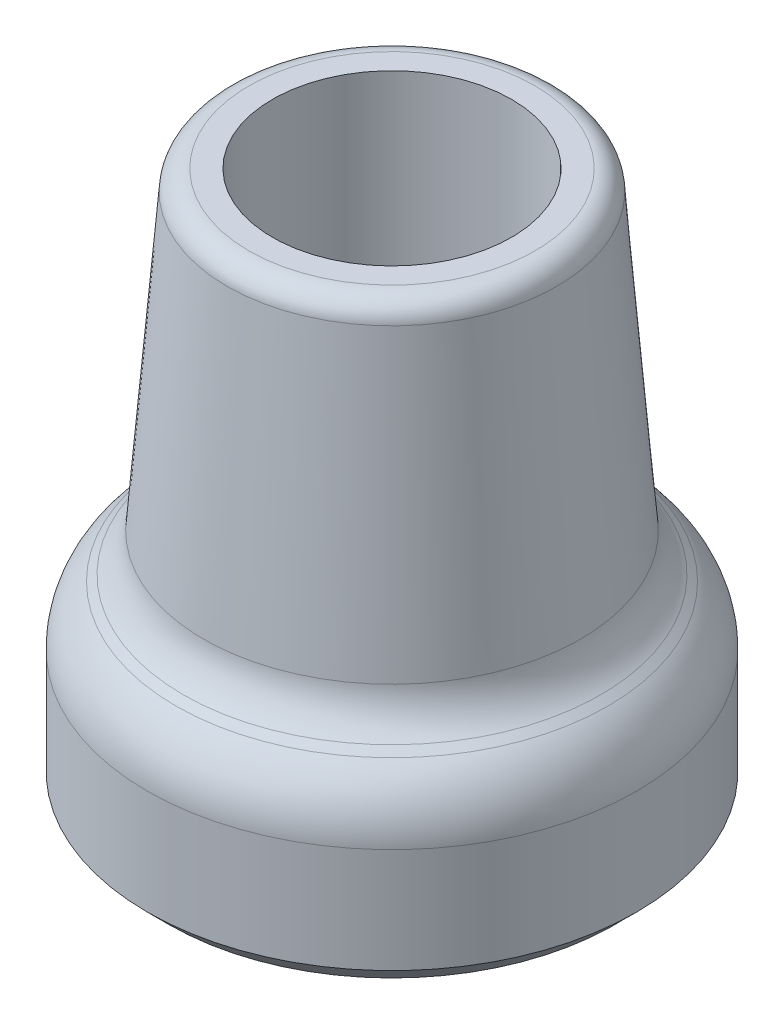
ISO-10303-21;
HEADER;
FILE_DESCRIPTION(('STEP AP214'),'2;1');
FILE_NAME('part.step','',(''),(''),'','','');
FILE_SCHEMA(('AUTOMOTIVE_DESIGN { 1 0 10303 214 1 1 1 1 }'));
ENDSEC;
DATA;
#1=APPLICATION_CONTEXT('core data for automotive mechanical design processes');
#2=APPLICATION_PROTOCOL_DEFINITION('international standard','automotive_design',2000,#1);
#3=PRODUCT_CONTEXT('',#1,'mechanical');
#4=PRODUCT('Part','Part','',(#3));
#5=PRODUCT_RELATED_PRODUCT_CATEGORY('part','',(#4));
#6=PRODUCT_DEFINITION_FORMATION('','',#4);
#7=PRODUCT_DEFINITION_CONTEXT('part definition',#1,'design');
#8=PRODUCT_DEFINITION('design','',#6,#7);
#9=PRODUCT_DEFINITION_SHAPE('','',#8);
#10=(LENGTH_UNIT() NAMED_UNIT(*) SI_UNIT(.MILLI.,.METRE.));
#11=(NAMED_UNIT(*) PLANE_ANGLE_UNIT() SI_UNIT($,.RADIAN.));
#12=(NAMED_UNIT(*) SI_UNIT($,.STERADIAN.) SOLID_ANGLE_UNIT());
#13=UNCERTAINTY_MEASURE_WITH_UNIT(LENGTH_MEASURE(1.E-05),#10,'distance_accuracy_value','');
#14=(GEOMETRIC_REPRESENTATION_CONTEXT(3) GLOBAL_UNCERTAINTY_ASSIGNED_CONTEXT((#13)) GLOBAL_UNIT_ASSIGNED_CONTEXT((#10,
#11,#12)) REPRESENTATION_CONTEXT('',''));
#15=CARTESIAN_POINT('',(0.,0.,0.));
#16=DIRECTION('',(0.,0.,1.));
#17=DIRECTION('',(1.,0.,0.));
#18=AXIS2_PLACEMENT_3D('',#15,#16,#17);
#19=CARTESIAN_POINT('',(0.,20.,0.));
#20=DIRECTION('',(0.,-1.,0.));
#21=DIRECTION('',(0.,0.,-1.));
#22=AXIS2_PLACEMENT_3D('',#19,#20,#21);
#23=PLANE('',#22);
#24=CARTESIAN_POINT('',(0.,20.,0.));
#25=DIRECTION('',(0.,-1.,0.));
#26=DIRECTION('',(0.,0.,-1.));
#27=AXIS2_PLACEMENT_3D('',#24,#25,#26);
#28=CIRCLE('',#27,10.);
#29=CARTESIAN_POINT('',(0.,20.,-10.));
#30=VERTEX_POINT('',#29);
#31=EDGE_CURVE('E10',#30,#30,#28,.F.);
#32=ORIENTED_EDGE('',*,*,#31,.T.);
#33=EDGE_LOOP('',(#32));
#34=FACE_BOUND('',#33,.T.);
#35=ADVANCED_FACE('F32',(#34),#23,.F.);
#36=CARTESIAN_POINT('',(0.,0.,0.));
#37=DIRECTION('',(0.,-1.,0.));
#38=DIRECTION('',(0.,0.,-1.));
#39=AXIS2_PLACEMENT_3D('',#36,#37,#38);
#40=CYLINDRICAL_SURFACE('',#39,11.);
#41=CARTESIAN_POINT('',(0.,21.,0.));
#42=DIRECTION('',(0.,-1.,0.));
#43=DIRECTION('',(0.,0.,-1.));
#44=AXIS2_PLACEMENT_3D('',#41,#42,#43);
#45=CIRCLE('',#44,11.);
#46=CARTESIAN_POINT('',(0.,21.,-11.));
#47=VERTEX_POINT('',#46);
#48=EDGE_CURVE('E39',#47,#47,#45,.T.);
#49=ORIENTED_EDGE('',*,*,#48,.T.);
#50=EDGE_LOOP('',(#49));
#51=FACE_BOUND('',#50,.T.);
#52=CARTESIAN_POINT('',(0.,50.,0.));
#53=DIRECTION('',(0.,-1.,0.));
#54=DIRECTION('',(0.,0.,-1.));
#55=AXIS2_PLACEMENT_3D('',#52,#53,#54);
#56=CIRCLE('',#55,11.);
#57=CARTESIAN_POINT('',(0.,50.,-11.));
#58=VERTEX_POINT('',#57);
#59=EDGE_CURVE('E70',#58,#58,#56,.T.);
#60=ORIENTED_EDGE('',*,*,#59,.F.);
#61=EDGE_LOOP('',(#60));
#62=FACE_BOUND('',#61,.T.);
#63=ADVANCED_FACE('F76',(#51,#62),#40,.F.);
#64=CARTESIAN_POINT('',(-11.,50.,0.));
#65=DIRECTION('',(0.,-1.,0.));
#66=DIRECTION('',(0.,0.,-1.));
#67=AXIS2_PLACEMENT_3D('',#64,#65,#66);
#68=PLANE('',#67);
#69=CARTESIAN_POINT('',(0.,50.,0.));
#70=DIRECTION('',(0.,-1.,0.));
#71=DIRECTION('',(0.,0.,-1.));
#72=AXIS2_PLACEMENT_3D('',#69,#70,#71);
#73=CIRCLE('',#72,13.1547972206343);
#74=CARTESIAN_POINT('',(0.,50.,-13.1547972206343));
#75=VERTEX_POINT('',#74);
#76=EDGE_CURVE('E64',#75,#75,#73,.F.);
#77=ORIENTED_EDGE('',*,*,#76,.T.);
#78=EDGE_LOOP('',(#77));
#79=FACE_BOUND('',#78,.T.);
#80=ORIENTED_EDGE('',*,*,#59,.T.);
#81=EDGE_LOOP('',(#80));
#82=FACE_BOUND('',#81,.T.);
#83=ADVANCED_FACE('F74',(#79,#82),#68,.F.);
#84=CARTESIAN_POINT('',(0.,50.,0.));
#85=DIRECTION('',(0.,-1.,0.));
#86=DIRECTION('',(0.,0.,-1.));
#87=AXIS2_PLACEMENT_3D('',#84,#85,#86);
#88=CONICAL_SURFACE('',#87,15.,0.0804710112654609);
#89=CARTESIAN_POINT('',(0.,21.1530541897,0.));
#90=DIRECTION('',(0.,-1.,0.));
#91=DIRECTION('',(0.,0.,-1.));
#92=AXIS2_PLACEMENT_3D('',#89,#90,#91);
#93=CIRCLE('',#92,17.3263665976048);
#94=CARTESIAN_POINT('',(0.,21.1530541897,-17.3263665976048));
#95=VERTEX_POINT('',#94);
#96=EDGE_CURVE('E58',#95,#95,#93,.F.);
#97=ORIENTED_EDGE('',*,*,#96,.T.);
#98=EDGE_LOOP('',(#97));
#99=FACE_BOUND('',#98,.T.);
#100=CARTESIAN_POINT('',(0.,48.1607683798407,0.));
#101=DIRECTION('',(0.,1.,0.));
#102=DIRECTION('',(0.,0.,1.));
#103=AXIS2_PLACEMENT_3D('',#100,#101,#102);
#104=CIRCLE('',#103,15.148325130658);
#105=CARTESIAN_POINT('',(0.,48.1607683798407,15.148325130658));
#106=VERTEX_POINT('',#105);
#107=EDGE_CURVE('E67',#106,#106,#104,.F.);
#108=ORIENTED_EDGE('',*,*,#107,.T.);
#109=EDGE_LOOP('',(#108));
#110=FACE_BOUND('',#109,.T.);
#111=ADVANCED_FACE('F83',(#99,#110),#88,.T.);
#112=CARTESIAN_POINT('',(0.,19.,0.));
#113=DIRECTION('',(0.,-1.,0.));
#114=DIRECTION('',(0.,0.,-1.));
#115=AXIS2_PLACEMENT_3D('',#112,#113,#114);
#116=CONICAL_SURFACE('',#115,17.5,0.896055384571344);
#117=CARTESIAN_POINT('',(0.,17.1017077336952,0.));
#118=DIRECTION('',(0.,1.,0.));
#119=DIRECTION('',(0.,0.,1.));
#120=AXIS2_PLACEMENT_3D('',#117,#118,#119);
#121=CIRCLE('',#120,19.872865332881);
#122=CARTESIAN_POINT('',(0.,17.1017077336952,19.872865332881));
#123=VERTEX_POINT('',#122);
#124=EDGE_CURVE('E52',#123,#123,#121,.T.);
#125=ORIENTED_EDGE('',*,*,#124,.T.);
#126=EDGE_LOOP('',(#125));
#127=FACE_BOUND('',#126,.T.);
#128=CARTESIAN_POINT('',(0.,17.6506310920864,0.));
#129=DIRECTION('',(0.,-1.,0.));
#130=DIRECTION('',(0.,0.,-1.));
#131=AXIS2_PLACEMENT_3D('',#128,#129,#130);
#132=CIRCLE('',#131,19.1867111348919);
#133=CARTESIAN_POINT('',(0.,17.6506310920864,-19.1867111348919));
#134=VERTEX_POINT('',#133);
#135=EDGE_CURVE('E61',#134,#134,#132,.T.);
#136=ORIENTED_EDGE('',*,*,#135,.T.);
#137=EDGE_LOOP('',(#136));
#138=FACE_BOUND('',#137,.T.);
#139=ADVANCED_FACE('F118',(#127,#138),#116,.T.);
#140=CARTESIAN_POINT('',(0.,0.,0.));
#141=DIRECTION('',(0.,-1.,0.));
#142=DIRECTION('',(0.,0.,-1.));
#143=AXIS2_PLACEMENT_3D('',#140,#141,#142);
#144=CYLINDRICAL_SURFACE('',#143,22.5);
#145=CARTESIAN_POINT('',(0.,2.00000000000003,0.));
#146=DIRECTION('',(0.,1.,0.));
#147=DIRECTION('',(0.,0.,1.));
#148=AXIS2_PLACEMENT_3D('',#145,#146,#147);
#149=CIRCLE('',#148,22.5);
#150=CARTESIAN_POINT('',(0.,2.00000000000003,22.5));
#151=VERTEX_POINT('',#150);
#152=EDGE_CURVE('E43',#151,#151,#149,.T.);
#153=ORIENTED_EDGE('',*,*,#152,.T.);
#154=EDGE_LOOP('',(#153));
#155=FACE_BOUND('',#154,.T.);
#156=CARTESIAN_POINT('',(0.,11.635626067594,0.));
#157=DIRECTION('',(0.,1.,0.));
#158=DIRECTION('',(0.,0.,1.));
#159=AXIS2_PLACEMENT_3D('',#156,#157,#158);
#160=CIRCLE('',#159,22.5);
#161=CARTESIAN_POINT('',(0.,11.635626067594,22.5));
#162=VERTEX_POINT('',#161);
#163=EDGE_CURVE('E55',#162,#162,#160,.F.);
#164=ORIENTED_EDGE('',*,*,#163,.T.);
#165=EDGE_LOOP('',(#164));
#166=FACE_BOUND('',#165,.T.);
#167=ADVANCED_FACE('F113',(#155,#166),#144,.T.);
#168=CARTESIAN_POINT('',(-22.5,0.,0.));
#169=DIRECTION('',(0.,1.,0.));
#170=DIRECTION('',(0.,0.,1.));
#171=AXIS2_PLACEMENT_3D('',#168,#169,#170);
#172=PLANE('',#171);
#173=CARTESIAN_POINT('',(0.,0.,0.));
#174=DIRECTION('',(0.,1.,0.));
#175=DIRECTION('',(0.,0.,1.));
#176=AXIS2_PLACEMENT_3D('',#173,#174,#175);
#177=CIRCLE('',#176,20.5);
#178=CARTESIAN_POINT('',(0.,0.,20.5));
#179=VERTEX_POINT('',#178);
#180=EDGE_CURVE('E47',#179,#179,#177,.F.);
#181=ORIENTED_EDGE('',*,*,#180,.T.);
#182=EDGE_LOOP('',(#181));
#183=FACE_BOUND('',#182,.T.);
#184=ADVANCED_FACE('F93',(#183),#172,.F.);
#185=CARTESIAN_POINT('',(0.,48.,0.));
#186=DIRECTION('',(0.,-1.,0.));
#187=DIRECTION('',(0.,0.,-1.));
#188=AXIS2_PLACEMENT_3D('',#185,#186,#187);
#189=TOROIDAL_SURFACE('',#188,13.1547972206343,2.);
#190=ORIENTED_EDGE('',*,*,#76,.F.);
#191=EDGE_LOOP('',(#190));
#192=FACE_BOUND('',#191,.T.);
#193=ORIENTED_EDGE('',*,*,#107,.F.);
#194=EDGE_LOOP('',(#193));
#195=FACE_BOUND('',#194,.T.);
#196=ADVANCED_FACE('F89',(#192,#195),#189,.T.);
#197=CARTESIAN_POINT('',(0.,21.5549751393016,0.));
#198=DIRECTION('',(0.,-1.,0.));
#199=DIRECTION('',(0.,0.,-1.));
#200=AXIS2_PLACEMENT_3D('',#197,#198,#199);
#201=TOROIDAL_SURFACE('',#200,22.3101863726641,5.);
#202=ORIENTED_EDGE('',*,*,#96,.F.);
#203=EDGE_LOOP('',(#202));
#204=FACE_BOUND('',#203,.T.);
#205=ORIENTED_EDGE('',*,*,#135,.F.);
#206=EDGE_LOOP('',(#205));
#207=FACE_BOUND('',#206,.T.);
#208=ADVANCED_FACE('F92',(#204,#207),#201,.F.);
#209=CARTESIAN_POINT('',(0.,11.635626067594,0.));
#210=DIRECTION('',(0.,1.,0.));
#211=DIRECTION('',(0.,0.,1.));
#212=AXIS2_PLACEMENT_3D('',#209,#210,#211);
#213=TOROIDAL_SURFACE('',#212,15.5,7.);
#214=ORIENTED_EDGE('',*,*,#124,.F.);
#215=EDGE_LOOP('',(#214));
#216=FACE_BOUND('',#215,.T.);
#217=ORIENTED_EDGE('',*,*,#163,.F.);
#218=EDGE_LOOP('',(#217));
#219=FACE_BOUND('',#218,.T.);
#220=ADVANCED_FACE('F97',(#216,#219),#213,.T.);
#221=CARTESIAN_POINT('',(0.,0.,0.));
#222=DIRECTION('',(0.,1.,0.));
#223=DIRECTION('',(0.,0.,1.));
#224=AXIS2_PLACEMENT_3D('',#221,#222,#223);
#225=CONICAL_SURFACE('',#224,20.5,0.785398163397447);
#226=ORIENTED_EDGE('',*,*,#152,.F.);
#227=EDGE_LOOP('',(#226));
#228=FACE_BOUND('',#227,.T.);
#229=ORIENTED_EDGE('',*,*,#180,.F.);
#230=EDGE_LOOP('',(#229));
#231=FACE_BOUND('',#230,.T.);
#232=ADVANCED_FACE('F100',(#228,#231),#225,.T.);
#233=CARTESIAN_POINT('',(0.,21.,0.));
#234=DIRECTION('',(0.,-1.,0.));
#235=DIRECTION('',(0.,0.,-1.));
#236=AXIS2_PLACEMENT_3D('',#233,#234,#235);
#237=TOROIDAL_SURFACE('',#236,10.,1.);
#238=ORIENTED_EDGE('',*,*,#31,.F.);
#239=EDGE_LOOP('',(#238));
#240=FACE_BOUND('',#239,.T.);
#241=ORIENTED_EDGE('',*,*,#48,.F.);
#242=EDGE_LOOP('',(#241));
#243=FACE_BOUND('',#242,.T.);
#244=ADVANCED_FACE('F34',(#240,#243),#237,.F.);
#245=CLOSED_SHELL('',(#35,#63,#83,#111,#139,#167,#184,#196,#208,#220,#232,#244));
#246=MANIFOLD_SOLID_BREP('B2',#245);
#247=ADVANCED_BREP_SHAPE_REPRESENTATION('',(#18,#246),#14);
#248=SHAPE_DEFINITION_REPRESENTATION(#9,#247);
ENDSEC;
END-ISO-10303-21;
